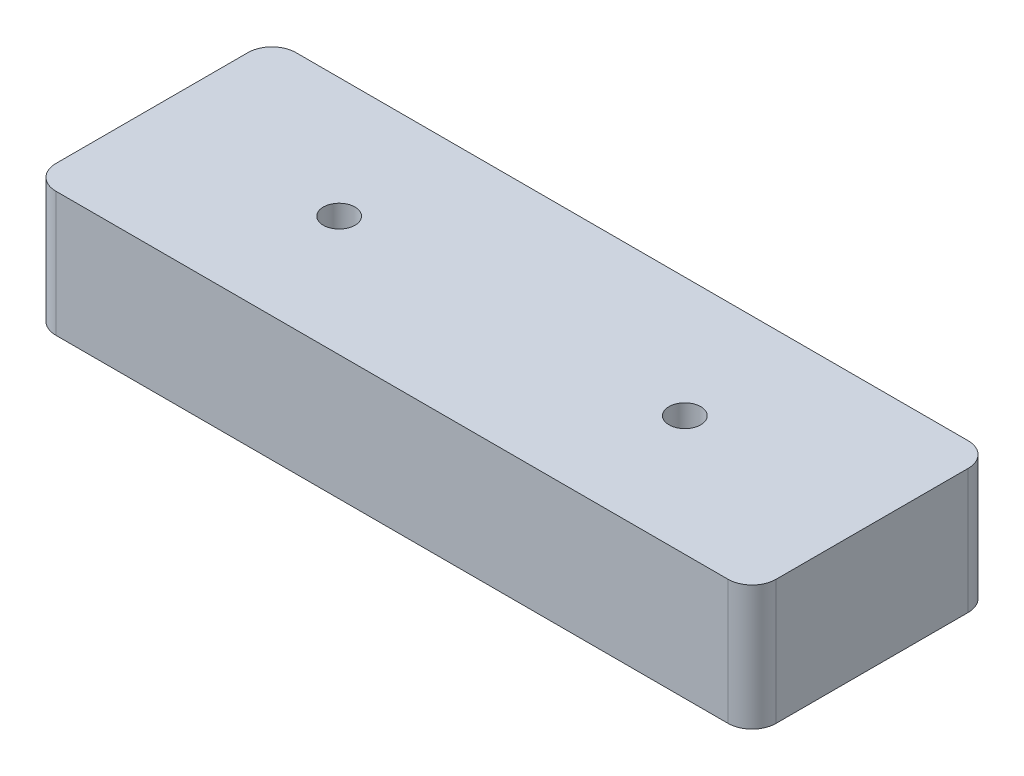
ISO-10303-21;
HEADER;
FILE_DESCRIPTION(('STEP AP214'),'2;1');
FILE_NAME('part.step','',(''),(''),'','','');
FILE_SCHEMA(('AUTOMOTIVE_DESIGN { 1 0 10303 214 1 1 1 1 }'));
ENDSEC;
DATA;
#1=APPLICATION_CONTEXT('core data for automotive mechanical design processes');
#2=APPLICATION_PROTOCOL_DEFINITION('international standard','automotive_design',2000,#1);
#3=PRODUCT_CONTEXT('',#1,'mechanical');
#4=PRODUCT('Part','Part','',(#3));
#5=PRODUCT_RELATED_PRODUCT_CATEGORY('part','',(#4));
#6=PRODUCT_DEFINITION_FORMATION('','',#4);
#7=PRODUCT_DEFINITION_CONTEXT('part definition',#1,'design');
#8=PRODUCT_DEFINITION('design','',#6,#7);
#9=PRODUCT_DEFINITION_SHAPE('','',#8);
#10=(LENGTH_UNIT() NAMED_UNIT(*) SI_UNIT(.MILLI.,.METRE.));
#11=(NAMED_UNIT(*) PLANE_ANGLE_UNIT() SI_UNIT($,.RADIAN.));
#12=(NAMED_UNIT(*) SI_UNIT($,.STERADIAN.) SOLID_ANGLE_UNIT());
#13=UNCERTAINTY_MEASURE_WITH_UNIT(LENGTH_MEASURE(1.E-05),#10,'distance_accuracy_value','');
#14=(GEOMETRIC_REPRESENTATION_CONTEXT(3) GLOBAL_UNCERTAINTY_ASSIGNED_CONTEXT((#13)) GLOBAL_UNIT_ASSIGNED_CONTEXT((#10,
#11,#12)) REPRESENTATION_CONTEXT('',''));
#15=CARTESIAN_POINT('',(0.,0.,0.));
#16=DIRECTION('',(0.,0.,1.));
#17=DIRECTION('',(1.,0.,0.));
#18=AXIS2_PLACEMENT_3D('',#15,#16,#17);
#19=CARTESIAN_POINT('',(37.5,13.,-12.5));
#20=DIRECTION('',(-1.,0.,0.));
#21=DIRECTION('',(0.,0.,1.));
#22=AXIS2_PLACEMENT_3D('',#19,#20,#21);
#23=PLANE('',#22);
#24=DIRECTION('',(0.,0.,-1.));
#25=VECTOR('',#24,1.);
#26=CARTESIAN_POINT('',(37.5,0.,-12.5));
#27=LINE('',#26,#25);
#28=CARTESIAN_POINT('',(37.5,0.,10.));
#29=VERTEX_POINT('',#28);
#30=CARTESIAN_POINT('',(37.5,0.,-10.));
#31=VERTEX_POINT('',#30);
#32=EDGE_CURVE('E139',#29,#31,#27,.T.);
#33=ORIENTED_EDGE('',*,*,#32,.T.);
#34=DIRECTION('',(0.,-1.,0.));
#35=VECTOR('',#34,1.);
#36=CARTESIAN_POINT('',(37.5,13.,-10.));
#37=LINE('',#36,#35);
#38=CARTESIAN_POINT('',(37.5,13.,-10.));
#39=VERTEX_POINT('',#38);
#40=EDGE_CURVE('E113',#31,#39,#37,.F.);
#41=ORIENTED_EDGE('',*,*,#40,.T.);
#42=DIRECTION('',(0.,0.,-1.));
#43=VECTOR('',#42,1.);
#44=CARTESIAN_POINT('',(37.5,13.,-12.5));
#45=LINE('',#44,#43);
#46=CARTESIAN_POINT('',(37.5,13.,10.));
#47=VERTEX_POINT('',#46);
#48=EDGE_CURVE('E153',#47,#39,#45,.T.);
#49=ORIENTED_EDGE('',*,*,#48,.F.);
#50=DIRECTION('',(0.,-1.,0.));
#51=VECTOR('',#50,1.);
#52=CARTESIAN_POINT('',(37.5,13.,10.));
#53=LINE('',#52,#51);
#54=EDGE_CURVE('E119',#47,#29,#53,.T.);
#55=ORIENTED_EDGE('',*,*,#54,.T.);
#56=EDGE_LOOP('',(#33,#41,#49,#55));
#57=FACE_BOUND('',#56,.T.);
#58=ADVANCED_FACE('F40',(#57),#23,.F.);
#59=CARTESIAN_POINT('',(-37.5,13.,-12.5));
#60=DIRECTION('',(0.,0.,1.));
#61=DIRECTION('',(1.,0.,0.));
#62=AXIS2_PLACEMENT_3D('',#59,#60,#61);
#63=PLANE('',#62);
#64=DIRECTION('',(-1.,0.,0.));
#65=VECTOR('',#64,1.);
#66=CARTESIAN_POINT('',(-37.5,13.,-12.5));
#67=LINE('',#66,#65);
#68=CARTESIAN_POINT('',(35.,13.,-12.5));
#69=VERTEX_POINT('',#68);
#70=CARTESIAN_POINT('',(-35.,13.,-12.5));
#71=VERTEX_POINT('',#70);
#72=EDGE_CURVE('E129',#69,#71,#67,.T.);
#73=ORIENTED_EDGE('',*,*,#72,.F.);
#74=DIRECTION('',(0.,-1.,0.));
#75=VECTOR('',#74,1.);
#76=CARTESIAN_POINT('',(35.,13.,-12.5));
#77=LINE('',#76,#75);
#78=CARTESIAN_POINT('',(35.,0.,-12.5));
#79=VERTEX_POINT('',#78);
#80=EDGE_CURVE('E112',#69,#79,#77,.T.);
#81=ORIENTED_EDGE('',*,*,#80,.T.);
#82=DIRECTION('',(-1.,0.,0.));
#83=VECTOR('',#82,1.);
#84=CARTESIAN_POINT('',(-37.5,0.,-12.5));
#85=LINE('',#84,#83);
#86=CARTESIAN_POINT('',(-35.,0.,-12.5));
#87=VERTEX_POINT('',#86);
#88=EDGE_CURVE('E126',#79,#87,#85,.T.);
#89=ORIENTED_EDGE('',*,*,#88,.T.);
#90=DIRECTION('',(0.,-1.,0.));
#91=VECTOR('',#90,1.);
#92=CARTESIAN_POINT('',(-35.,13.,-12.5));
#93=LINE('',#92,#91);
#94=EDGE_CURVE('E132',#87,#71,#93,.F.);
#95=ORIENTED_EDGE('',*,*,#94,.T.);
#96=EDGE_LOOP('',(#73,#81,#89,#95));
#97=FACE_BOUND('',#96,.T.);
#98=ADVANCED_FACE('F125',(#97),#63,.F.);
#99=CARTESIAN_POINT('',(-37.5,13.,-12.5));
#100=DIRECTION('',(1.,0.,0.));
#101=DIRECTION('',(0.,0.,-1.));
#102=AXIS2_PLACEMENT_3D('',#99,#100,#101);
#103=PLANE('',#102);
#104=DIRECTION('',(0.,0.,1.));
#105=VECTOR('',#104,1.);
#106=CARTESIAN_POINT('',(-37.5,13.,-12.5));
#107=LINE('',#106,#105);
#108=CARTESIAN_POINT('',(-37.5,13.,-10.));
#109=VERTEX_POINT('',#108);
#110=CARTESIAN_POINT('',(-37.5,13.,10.));
#111=VERTEX_POINT('',#110);
#112=EDGE_CURVE('E190',#109,#111,#107,.T.);
#113=ORIENTED_EDGE('',*,*,#112,.F.);
#114=DIRECTION('',(0.,-1.,0.));
#115=VECTOR('',#114,1.);
#116=CARTESIAN_POINT('',(-37.5,13.,-10.));
#117=LINE('',#116,#115);
#118=CARTESIAN_POINT('',(-37.5,0.,-10.));
#119=VERTEX_POINT('',#118);
#120=EDGE_CURVE('E11',#109,#119,#117,.T.);
#121=ORIENTED_EDGE('',*,*,#120,.T.);
#122=DIRECTION('',(0.,0.,1.));
#123=VECTOR('',#122,1.);
#124=CARTESIAN_POINT('',(-37.5,0.,-12.5));
#125=LINE('',#124,#123);
#126=CARTESIAN_POINT('',(-37.5,0.,10.));
#127=VERTEX_POINT('',#126);
#128=EDGE_CURVE('E138',#119,#127,#125,.T.);
#129=ORIENTED_EDGE('',*,*,#128,.T.);
#130=DIRECTION('',(0.,-1.,0.));
#131=VECTOR('',#130,1.);
#132=CARTESIAN_POINT('',(-37.5,13.,10.));
#133=LINE('',#132,#131);
#134=EDGE_CURVE('E49',#127,#111,#133,.F.);
#135=ORIENTED_EDGE('',*,*,#134,.T.);
#136=EDGE_LOOP('',(#113,#121,#129,#135));
#137=FACE_BOUND('',#136,.T.);
#138=ADVANCED_FACE('F189',(#137),#103,.F.);
#139=CARTESIAN_POINT('',(-37.5,13.,12.5));
#140=DIRECTION('',(0.,0.,-1.));
#141=DIRECTION('',(-1.,0.,0.));
#142=AXIS2_PLACEMENT_3D('',#139,#140,#141);
#143=PLANE('',#142);
#144=DIRECTION('',(1.,0.,0.));
#145=VECTOR('',#144,1.);
#146=CARTESIAN_POINT('',(-37.5,0.,12.5));
#147=LINE('',#146,#145);
#148=CARTESIAN_POINT('',(-35.,0.,12.5));
#149=VERTEX_POINT('',#148);
#150=CARTESIAN_POINT('',(35.,0.,12.5));
#151=VERTEX_POINT('',#150);
#152=EDGE_CURVE('E145',#149,#151,#147,.T.);
#153=ORIENTED_EDGE('',*,*,#152,.T.);
#154=DIRECTION('',(0.,-1.,0.));
#155=VECTOR('',#154,1.);
#156=CARTESIAN_POINT('',(35.,13.,12.5));
#157=LINE('',#156,#155);
#158=CARTESIAN_POINT('',(35.,13.,12.5));
#159=VERTEX_POINT('',#158);
#160=EDGE_CURVE('E56',#151,#159,#157,.F.);
#161=ORIENTED_EDGE('',*,*,#160,.T.);
#162=DIRECTION('',(1.,0.,0.));
#163=VECTOR('',#162,1.);
#164=CARTESIAN_POINT('',(-37.5,13.,12.5));
#165=LINE('',#164,#163);
#166=CARTESIAN_POINT('',(-35.,13.,12.5));
#167=VERTEX_POINT('',#166);
#168=EDGE_CURVE('E155',#167,#159,#165,.T.);
#169=ORIENTED_EDGE('',*,*,#168,.F.);
#170=DIRECTION('',(0.,-1.,0.));
#171=VECTOR('',#170,1.);
#172=CARTESIAN_POINT('',(-35.,13.,12.5));
#173=LINE('',#172,#171);
#174=EDGE_CURVE('E179',#167,#149,#173,.T.);
#175=ORIENTED_EDGE('',*,*,#174,.T.);
#176=EDGE_LOOP('',(#153,#161,#169,#175));
#177=FACE_BOUND('',#176,.T.);
#178=ADVANCED_FACE('F200',(#177),#143,.F.);
#179=CARTESIAN_POINT('',(0.,13.,0.));
#180=DIRECTION('',(0.,1.,0.));
#181=DIRECTION('',(0.,0.,1.));
#182=AXIS2_PLACEMENT_3D('',#179,#180,#181);
#183=PLANE('',#182);
#184=CARTESIAN_POINT('',(-18.,13.,0.));
#185=DIRECTION('',(0.,1.,0.));
#186=DIRECTION('',(0.,0.,1.));
#187=AXIS2_PLACEMENT_3D('',#184,#185,#186);
#188=CIRCLE('',#187,1.64999999999999);
#189=CARTESIAN_POINT('',(-18.,13.,1.64999999999999));
#190=VERTEX_POINT('',#189);
#191=EDGE_CURVE('E242',#190,#190,#188,.T.);
#192=ORIENTED_EDGE('',*,*,#191,.F.);
#193=EDGE_LOOP('',(#192));
#194=FACE_BOUND('',#193,.T.);
#195=CARTESIAN_POINT('',(18.,13.,0.));
#196=DIRECTION('',(0.,1.,0.));
#197=DIRECTION('',(0.,0.,1.));
#198=AXIS2_PLACEMENT_3D('',#195,#196,#197);
#199=CIRCLE('',#198,1.64999999999999);
#200=CARTESIAN_POINT('',(18.,13.,1.64999999999998));
#201=VERTEX_POINT('',#200);
#202=EDGE_CURVE('E234',#201,#201,#199,.T.);
#203=ORIENTED_EDGE('',*,*,#202,.F.);
#204=EDGE_LOOP('',(#203));
#205=FACE_BOUND('',#204,.T.);
#206=ORIENTED_EDGE('',*,*,#48,.T.);
#207=CARTESIAN_POINT('',(35.,13.,-10.));
#208=DIRECTION('',(0.,1.,0.));
#209=DIRECTION('',(0.,0.,1.));
#210=AXIS2_PLACEMENT_3D('',#207,#208,#209);
#211=CIRCLE('',#210,2.5);
#212=EDGE_CURVE('E176',#39,#69,#211,.T.);
#213=ORIENTED_EDGE('',*,*,#212,.T.);
#214=ORIENTED_EDGE('',*,*,#72,.T.);
#215=CARTESIAN_POINT('',(-35.,13.,-10.));
#216=DIRECTION('',(0.,1.,0.));
#217=DIRECTION('',(0.,0.,1.));
#218=AXIS2_PLACEMENT_3D('',#215,#216,#217);
#219=CIRCLE('',#218,2.5);
#220=EDGE_CURVE('E170',#71,#109,#219,.T.);
#221=ORIENTED_EDGE('',*,*,#220,.T.);
#222=ORIENTED_EDGE('',*,*,#112,.T.);
#223=CARTESIAN_POINT('',(-35.,13.,10.));
#224=DIRECTION('',(0.,1.,0.));
#225=DIRECTION('',(0.,0.,1.));
#226=AXIS2_PLACEMENT_3D('',#223,#224,#225);
#227=CIRCLE('',#226,2.5);
#228=EDGE_CURVE('E63',#111,#167,#227,.T.);
#229=ORIENTED_EDGE('',*,*,#228,.T.);
#230=ORIENTED_EDGE('',*,*,#168,.T.);
#231=CARTESIAN_POINT('',(35.,13.,10.));
#232=DIRECTION('',(0.,1.,0.));
#233=DIRECTION('',(0.,0.,1.));
#234=AXIS2_PLACEMENT_3D('',#231,#232,#233);
#235=CIRCLE('',#234,2.5);
#236=EDGE_CURVE('E173',#159,#47,#235,.T.);
#237=ORIENTED_EDGE('',*,*,#236,.T.);
#238=EDGE_LOOP('',(#206,#213,#214,#221,#222,#229,#230,#237));
#239=FACE_BOUND('',#238,.T.);
#240=ADVANCED_FACE('F194',(#194,#205,#239),#183,.T.);
#241=CARTESIAN_POINT('',(0.,0.,0.));
#242=DIRECTION('',(0.,1.,0.));
#243=DIRECTION('',(0.,0.,1.));
#244=AXIS2_PLACEMENT_3D('',#241,#242,#243);
#245=PLANE('',#244);
#246=CARTESIAN_POINT('',(-18.,0.,0.));
#247=DIRECTION('',(0.,1.,0.));
#248=DIRECTION('',(0.,0.,1.));
#249=AXIS2_PLACEMENT_3D('',#246,#247,#248);
#250=CIRCLE('',#249,1.65);
#251=CARTESIAN_POINT('',(-18.,0.,1.65));
#252=VERTEX_POINT('',#251);
#253=EDGE_CURVE('E238',#252,#252,#250,.T.);
#254=ORIENTED_EDGE('',*,*,#253,.T.);
#255=EDGE_LOOP('',(#254));
#256=FACE_BOUND('',#255,.T.);
#257=CARTESIAN_POINT('',(18.,0.,0.));
#258=DIRECTION('',(0.,1.,0.));
#259=DIRECTION('',(0.,0.,1.));
#260=AXIS2_PLACEMENT_3D('',#257,#258,#259);
#261=CIRCLE('',#260,1.65);
#262=CARTESIAN_POINT('',(18.,0.,1.64999999999999));
#263=VERTEX_POINT('',#262);
#264=EDGE_CURVE('E147',#263,#263,#261,.T.);
#265=ORIENTED_EDGE('',*,*,#264,.T.);
#266=EDGE_LOOP('',(#265));
#267=FACE_BOUND('',#266,.T.);
#268=ORIENTED_EDGE('',*,*,#88,.F.);
#269=CARTESIAN_POINT('',(35.,0.,-10.));
#270=DIRECTION('',(0.,1.,0.));
#271=DIRECTION('',(0.,0.,1.));
#272=AXIS2_PLACEMENT_3D('',#269,#270,#271);
#273=CIRCLE('',#272,2.5);
#274=EDGE_CURVE('E108',#79,#31,#273,.F.);
#275=ORIENTED_EDGE('',*,*,#274,.T.);
#276=ORIENTED_EDGE('',*,*,#32,.F.);
#277=CARTESIAN_POINT('',(35.,0.,10.));
#278=DIRECTION('',(0.,1.,0.));
#279=DIRECTION('',(0.,0.,1.));
#280=AXIS2_PLACEMENT_3D('',#277,#278,#279);
#281=CIRCLE('',#280,2.5);
#282=EDGE_CURVE('E120',#29,#151,#281,.F.);
#283=ORIENTED_EDGE('',*,*,#282,.T.);
#284=ORIENTED_EDGE('',*,*,#152,.F.);
#285=CARTESIAN_POINT('',(-35.,0.,10.));
#286=DIRECTION('',(0.,1.,0.));
#287=DIRECTION('',(0.,0.,1.));
#288=AXIS2_PLACEMENT_3D('',#285,#286,#287);
#289=CIRCLE('',#288,2.5);
#290=EDGE_CURVE('E131',#149,#127,#289,.F.);
#291=ORIENTED_EDGE('',*,*,#290,.T.);
#292=ORIENTED_EDGE('',*,*,#128,.F.);
#293=CARTESIAN_POINT('',(-35.,0.,-10.));
#294=DIRECTION('',(0.,1.,0.));
#295=DIRECTION('',(0.,0.,1.));
#296=AXIS2_PLACEMENT_3D('',#293,#294,#295);
#297=CIRCLE('',#296,2.5);
#298=EDGE_CURVE('E136',#119,#87,#297,.F.);
#299=ORIENTED_EDGE('',*,*,#298,.T.);
#300=EDGE_LOOP('',(#268,#275,#276,#283,#284,#291,#292,#299));
#301=FACE_BOUND('',#300,.T.);
#302=ADVANCED_FACE('F134',(#256,#267,#301),#245,.F.);
#303=CARTESIAN_POINT('',(18.,13.,0.));
#304=DIRECTION('',(0.,1.,0.));
#305=DIRECTION('',(0.,0.,1.));
#306=AXIS2_PLACEMENT_3D('',#303,#304,#305);
#307=CYLINDRICAL_SURFACE('',#306,1.64999999999999);
#308=ORIENTED_EDGE('',*,*,#264,.F.);
#309=EDGE_LOOP('',(#308));
#310=FACE_BOUND('',#309,.T.);
#311=ORIENTED_EDGE('',*,*,#202,.T.);
#312=EDGE_LOOP('',(#311));
#313=FACE_BOUND('',#312,.T.);
#314=ADVANCED_FACE('F255',(#310,#313),#307,.F.);
#315=CARTESIAN_POINT('',(-18.,13.,0.));
#316=DIRECTION('',(0.,1.,0.));
#317=DIRECTION('',(0.,0.,1.));
#318=AXIS2_PLACEMENT_3D('',#315,#316,#317);
#319=CYLINDRICAL_SURFACE('',#318,1.64999999999999);
#320=ORIENTED_EDGE('',*,*,#253,.F.);
#321=EDGE_LOOP('',(#320));
#322=FACE_BOUND('',#321,.T.);
#323=ORIENTED_EDGE('',*,*,#191,.T.);
#324=EDGE_LOOP('',(#323));
#325=FACE_BOUND('',#324,.T.);
#326=ADVANCED_FACE('F248',(#322,#325),#319,.F.);
#327=CARTESIAN_POINT('',(35.,13.,-10.));
#328=DIRECTION('',(0.,-1.,0.));
#329=DIRECTION('',(0.,0.,-1.));
#330=AXIS2_PLACEMENT_3D('',#327,#328,#329);
#331=CYLINDRICAL_SURFACE('',#330,2.5);
#332=ORIENTED_EDGE('',*,*,#212,.F.);
#333=ORIENTED_EDGE('',*,*,#40,.F.);
#334=ORIENTED_EDGE('',*,*,#274,.F.);
#335=ORIENTED_EDGE('',*,*,#80,.F.);
#336=EDGE_LOOP('',(#332,#333,#334,#335));
#337=FACE_BOUND('',#336,.T.);
#338=ADVANCED_FACE('F111',(#337),#331,.T.);
#339=CARTESIAN_POINT('',(35.,13.,10.));
#340=DIRECTION('',(0.,-1.,0.));
#341=DIRECTION('',(0.,0.,-1.));
#342=AXIS2_PLACEMENT_3D('',#339,#340,#341);
#343=CYLINDRICAL_SURFACE('',#342,2.5);
#344=ORIENTED_EDGE('',*,*,#236,.F.);
#345=ORIENTED_EDGE('',*,*,#160,.F.);
#346=ORIENTED_EDGE('',*,*,#282,.F.);
#347=ORIENTED_EDGE('',*,*,#54,.F.);
#348=EDGE_LOOP('',(#344,#345,#346,#347));
#349=FACE_BOUND('',#348,.T.);
#350=ADVANCED_FACE('F204',(#349),#343,.T.);
#351=CARTESIAN_POINT('',(-35.,13.,-10.));
#352=DIRECTION('',(0.,-1.,0.));
#353=DIRECTION('',(0.,0.,-1.));
#354=AXIS2_PLACEMENT_3D('',#351,#352,#353);
#355=CYLINDRICAL_SURFACE('',#354,2.5);
#356=ORIENTED_EDGE('',*,*,#220,.F.);
#357=ORIENTED_EDGE('',*,*,#94,.F.);
#358=ORIENTED_EDGE('',*,*,#298,.F.);
#359=ORIENTED_EDGE('',*,*,#120,.F.);
#360=EDGE_LOOP('',(#356,#357,#358,#359));
#361=FACE_BOUND('',#360,.T.);
#362=ADVANCED_FACE('F279',(#361),#355,.T.);
#363=CARTESIAN_POINT('',(-35.,13.,10.));
#364=DIRECTION('',(0.,-1.,0.));
#365=DIRECTION('',(0.,0.,-1.));
#366=AXIS2_PLACEMENT_3D('',#363,#364,#365);
#367=CYLINDRICAL_SURFACE('',#366,2.5);
#368=ORIENTED_EDGE('',*,*,#228,.F.);
#369=ORIENTED_EDGE('',*,*,#134,.F.);
#370=ORIENTED_EDGE('',*,*,#290,.F.);
#371=ORIENTED_EDGE('',*,*,#174,.F.);
#372=EDGE_LOOP('',(#368,#369,#370,#371));
#373=FACE_BOUND('',#372,.T.);
#374=ADVANCED_FACE('F42',(#373),#367,.T.);
#375=CLOSED_SHELL('',(#58,#98,#138,#178,#240,#302,#314,#326,#338,#350,#362,#374));
#376=MANIFOLD_SOLID_BREP('B2',#375);
#377=ADVANCED_BREP_SHAPE_REPRESENTATION('',(#18,#376),#14);
#378=SHAPE_DEFINITION_REPRESENTATION(#9,#377);
ENDSEC;
END-ISO-10303-21;
